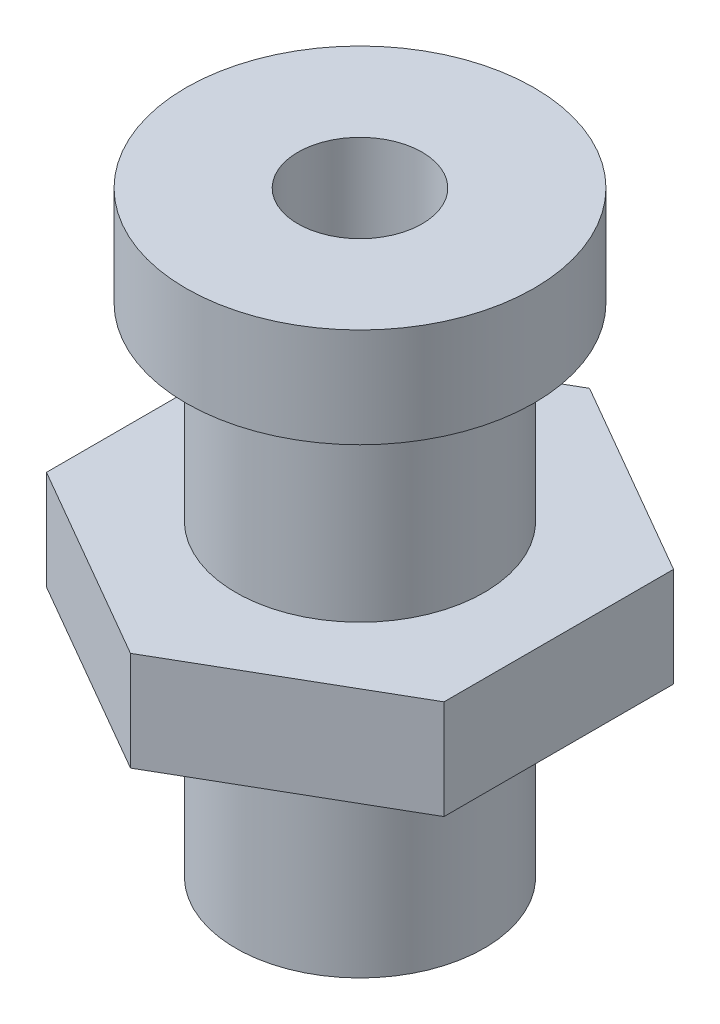
ISO-10303-21;
HEADER;
FILE_DESCRIPTION(('STEP AP214'),'2;1');
FILE_NAME('part.step','',(''),(''),'','','');
FILE_SCHEMA(('AUTOMOTIVE_DESIGN { 1 0 10303 214 1 1 1 1 }'));
ENDSEC;
DATA;
#1=APPLICATION_CONTEXT('core data for automotive mechanical design processes');
#2=APPLICATION_PROTOCOL_DEFINITION('international standard','automotive_design',2000,#1);
#3=PRODUCT_CONTEXT('',#1,'mechanical');
#4=PRODUCT('Part','Part','',(#3));
#5=PRODUCT_RELATED_PRODUCT_CATEGORY('part','',(#4));
#6=PRODUCT_DEFINITION_FORMATION('','',#4);
#7=PRODUCT_DEFINITION_CONTEXT('part definition',#1,'design');
#8=PRODUCT_DEFINITION('design','',#6,#7);
#9=PRODUCT_DEFINITION_SHAPE('','',#8);
#10=(LENGTH_UNIT() NAMED_UNIT(*) SI_UNIT(.MILLI.,.METRE.));
#11=(NAMED_UNIT(*) PLANE_ANGLE_UNIT() SI_UNIT($,.RADIAN.));
#12=(NAMED_UNIT(*) SI_UNIT($,.STERADIAN.) SOLID_ANGLE_UNIT());
#13=UNCERTAINTY_MEASURE_WITH_UNIT(LENGTH_MEASURE(1.E-05),#10,'distance_accuracy_value','');
#14=(GEOMETRIC_REPRESENTATION_CONTEXT(3) GLOBAL_UNCERTAINTY_ASSIGNED_CONTEXT((#13)) GLOBAL_UNIT_ASSIGNED_CONTEXT((#10,
#11,#12)) REPRESENTATION_CONTEXT('',''));
#15=CARTESIAN_POINT('',(0.,0.,0.));
#16=DIRECTION('',(0.,0.,1.));
#17=DIRECTION('',(1.,0.,0.));
#18=AXIS2_PLACEMENT_3D('',#15,#16,#17);
#19=CARTESIAN_POINT('',(0.,-2.,0.));
#20=DIRECTION('',(0.,-1.,0.));
#21=DIRECTION('',(0.,0.,-1.));
#22=AXIS2_PLACEMENT_3D('',#19,#20,#21);
#23=PLANE('',#22);
#24=DIRECTION('',(0.,0.,1.));
#25=VECTOR('',#24,1.);
#26=CARTESIAN_POINT('',(4.,-2.,-2.3094010767585));
#27=LINE('',#26,#25);
#28=CARTESIAN_POINT('',(4.,-2.,-2.3094010767585));
#29=VERTEX_POINT('',#28);
#30=CARTESIAN_POINT('',(4.,-2.,2.3094010767585));
#31=VERTEX_POINT('',#30);
#32=EDGE_CURVE('E129',#29,#31,#27,.T.);
#33=ORIENTED_EDGE('',*,*,#32,.T.);
#34=DIRECTION('',(-0.866025403784439,0.,0.5));
#35=VECTOR('',#34,1.);
#36=CARTESIAN_POINT('',(4.,-2.,2.3094010767585));
#37=LINE('',#36,#35);
#38=CARTESIAN_POINT('',(0.,-2.,4.61880215351701));
#39=VERTEX_POINT('',#38);
#40=EDGE_CURVE('E87',#31,#39,#37,.T.);
#41=ORIENTED_EDGE('',*,*,#40,.T.);
#42=DIRECTION('',(-0.866025403784439,0.,-0.5));
#43=VECTOR('',#42,1.);
#44=CARTESIAN_POINT('',(0.,-2.,4.61880215351701));
#45=LINE('',#44,#43);
#46=CARTESIAN_POINT('',(-4.,-2.,2.3094010767585));
#47=VERTEX_POINT('',#46);
#48=EDGE_CURVE('E100',#39,#47,#45,.T.);
#49=ORIENTED_EDGE('',*,*,#48,.T.);
#50=DIRECTION('',(0.,0.,-1.));
#51=VECTOR('',#50,1.);
#52=CARTESIAN_POINT('',(-4.,-2.,2.3094010767585));
#53=LINE('',#52,#51);
#54=CARTESIAN_POINT('',(-4.,-2.,-2.3094010767585));
#55=VERTEX_POINT('',#54);
#56=EDGE_CURVE('E94',#47,#55,#53,.T.);
#57=ORIENTED_EDGE('',*,*,#56,.T.);
#58=DIRECTION('',(0.866025403784439,0.,-0.5));
#59=VECTOR('',#58,1.);
#60=CARTESIAN_POINT('',(-4.,-2.,-2.3094010767585));
#61=LINE('',#60,#59);
#62=CARTESIAN_POINT('',(0.,-2.,-4.61880215351701));
#63=VERTEX_POINT('',#62);
#64=EDGE_CURVE('E98',#55,#63,#61,.T.);
#65=ORIENTED_EDGE('',*,*,#64,.T.);
#66=DIRECTION('',(0.866025403784439,0.,0.5));
#67=VECTOR('',#66,1.);
#68=CARTESIAN_POINT('',(0.,-2.,-4.61880215351701));
#69=LINE('',#68,#67);
#70=EDGE_CURVE('E49',#63,#29,#69,.T.);
#71=ORIENTED_EDGE('',*,*,#70,.T.);
#72=EDGE_LOOP('',(#33,#41,#49,#57,#65,#71));
#73=FACE_BOUND('',#72,.T.);
#74=CARTESIAN_POINT('',(0.,-2.,0.));
#75=DIRECTION('',(0.,-1.,0.));
#76=DIRECTION('',(0.,0.,-1.));
#77=AXIS2_PLACEMENT_3D('',#74,#75,#76);
#78=CIRCLE('',#77,2.5);
#79=CARTESIAN_POINT('',(0.,-2.,-2.5));
#80=VERTEX_POINT('',#79);
#81=EDGE_CURVE('E214',#80,#80,#78,.T.);
#82=ORIENTED_EDGE('',*,*,#81,.F.);
#83=EDGE_LOOP('',(#82));
#84=FACE_BOUND('',#83,.T.);
#85=ADVANCED_FACE('F32',(#73,#84),#23,.T.);
#86=CARTESIAN_POINT('',(0.,0.,0.));
#87=DIRECTION('',(0.,-1.,0.));
#88=DIRECTION('',(0.,0.,-1.));
#89=AXIS2_PLACEMENT_3D('',#86,#87,#88);
#90=CYLINDRICAL_SURFACE('',#89,1.25);
#91=CARTESIAN_POINT('',(0.,5.8,0.));
#92=DIRECTION('',(0.,-1.,0.));
#93=DIRECTION('',(0.,0.,-1.));
#94=AXIS2_PLACEMENT_3D('',#91,#92,#93);
#95=CIRCLE('',#94,1.25);
#96=CARTESIAN_POINT('',(0.,5.8,-1.25));
#97=VERTEX_POINT('',#96);
#98=EDGE_CURVE('E11',#97,#97,#95,.T.);
#99=ORIENTED_EDGE('',*,*,#98,.F.);
#100=EDGE_LOOP('',(#99));
#101=FACE_BOUND('',#100,.T.);
#102=CARTESIAN_POINT('',(0.,-6.2,0.));
#103=DIRECTION('',(0.,-1.,0.));
#104=DIRECTION('',(0.,0.,-1.));
#105=AXIS2_PLACEMENT_3D('',#102,#103,#104);
#106=CIRCLE('',#105,1.25);
#107=CARTESIAN_POINT('',(0.,-6.2,-1.25));
#108=VERTEX_POINT('',#107);
#109=EDGE_CURVE('E217',#108,#108,#106,.T.);
#110=ORIENTED_EDGE('',*,*,#109,.T.);
#111=EDGE_LOOP('',(#110));
#112=FACE_BOUND('',#111,.T.);
#113=ADVANCED_FACE('F34',(#101,#112),#90,.F.);
#114=CARTESIAN_POINT('',(1.25,5.8,0.));
#115=DIRECTION('',(0.,1.,0.));
#116=DIRECTION('',(0.,0.,1.));
#117=AXIS2_PLACEMENT_3D('',#114,#115,#116);
#118=PLANE('',#117);
#119=ORIENTED_EDGE('',*,*,#98,.T.);
#120=EDGE_LOOP('',(#119));
#121=FACE_BOUND('',#120,.T.);
#122=CARTESIAN_POINT('',(0.,5.8,0.));
#123=DIRECTION('',(0.,-1.,0.));
#124=DIRECTION('',(0.,0.,-1.));
#125=AXIS2_PLACEMENT_3D('',#122,#123,#124);
#126=CIRCLE('',#125,3.5);
#127=CARTESIAN_POINT('',(0.,5.8,-3.5));
#128=VERTEX_POINT('',#127);
#129=EDGE_CURVE('E41',#128,#128,#126,.T.);
#130=ORIENTED_EDGE('',*,*,#129,.F.);
#131=EDGE_LOOP('',(#130));
#132=FACE_BOUND('',#131,.T.);
#133=ADVANCED_FACE('F152',(#121,#132),#118,.T.);
#134=CARTESIAN_POINT('',(0.,0.,0.));
#135=DIRECTION('',(0.,-1.,0.));
#136=DIRECTION('',(0.,0.,-1.));
#137=AXIS2_PLACEMENT_3D('',#134,#135,#136);
#138=CYLINDRICAL_SURFACE('',#137,3.5);
#139=ORIENTED_EDGE('',*,*,#129,.T.);
#140=EDGE_LOOP('',(#139));
#141=FACE_BOUND('',#140,.T.);
#142=CARTESIAN_POINT('',(0.,3.8,0.));
#143=DIRECTION('',(0.,-1.,0.));
#144=DIRECTION('',(0.,0.,-1.));
#145=AXIS2_PLACEMENT_3D('',#142,#143,#144);
#146=CIRCLE('',#145,3.5);
#147=CARTESIAN_POINT('',(0.,3.8,-3.5));
#148=VERTEX_POINT('',#147);
#149=EDGE_CURVE('E144',#148,#148,#146,.T.);
#150=ORIENTED_EDGE('',*,*,#149,.F.);
#151=EDGE_LOOP('',(#150));
#152=FACE_BOUND('',#151,.T.);
#153=ADVANCED_FACE('F149',(#141,#152),#138,.T.);
#154=CARTESIAN_POINT('',(3.5,3.8,0.));
#155=DIRECTION('',(0.,-1.,0.));
#156=DIRECTION('',(0.,0.,-1.));
#157=AXIS2_PLACEMENT_3D('',#154,#155,#156);
#158=PLANE('',#157);
#159=ORIENTED_EDGE('',*,*,#149,.T.);
#160=EDGE_LOOP('',(#159));
#161=FACE_BOUND('',#160,.T.);
#162=CARTESIAN_POINT('',(0.,3.8,0.));
#163=DIRECTION('',(0.,-1.,0.));
#164=DIRECTION('',(0.,0.,-1.));
#165=AXIS2_PLACEMENT_3D('',#162,#163,#164);
#166=CIRCLE('',#165,2.5);
#167=CARTESIAN_POINT('',(0.,3.8,-2.5));
#168=VERTEX_POINT('',#167);
#169=EDGE_CURVE('E141',#168,#168,#166,.T.);
#170=ORIENTED_EDGE('',*,*,#169,.F.);
#171=EDGE_LOOP('',(#170));
#172=FACE_BOUND('',#171,.T.);
#173=ADVANCED_FACE('F159',(#161,#172),#158,.T.);
#174=CARTESIAN_POINT('',(0.,0.,0.));
#175=DIRECTION('',(0.,-1.,0.));
#176=DIRECTION('',(0.,0.,-1.));
#177=AXIS2_PLACEMENT_3D('',#174,#175,#176);
#178=CYLINDRICAL_SURFACE('',#177,2.5);
#179=ORIENTED_EDGE('',*,*,#169,.T.);
#180=EDGE_LOOP('',(#179));
#181=FACE_BOUND('',#180,.T.);
#182=CARTESIAN_POINT('',(0.,0.,0.));
#183=DIRECTION('',(0.,-1.,0.));
#184=DIRECTION('',(0.,0.,-1.));
#185=AXIS2_PLACEMENT_3D('',#182,#183,#184);
#186=CIRCLE('',#185,2.5);
#187=CARTESIAN_POINT('',(0.,0.,-2.5));
#188=VERTEX_POINT('',#187);
#189=EDGE_CURVE('E138',#188,#188,#186,.T.);
#190=ORIENTED_EDGE('',*,*,#189,.F.);
#191=EDGE_LOOP('',(#190));
#192=FACE_BOUND('',#191,.T.);
#193=ADVANCED_FACE('F174',(#181,#192),#178,.T.);
#194=CARTESIAN_POINT('',(0.,0.,0.));
#195=DIRECTION('',(0.,-1.,0.));
#196=DIRECTION('',(0.,0.,-1.));
#197=AXIS2_PLACEMENT_3D('',#194,#195,#196);
#198=PLANE('',#197);
#199=ORIENTED_EDGE('',*,*,#189,.T.);
#200=EDGE_LOOP('',(#199));
#201=FACE_BOUND('',#200,.T.);
#202=DIRECTION('',(0.,0.,1.));
#203=VECTOR('',#202,1.);
#204=CARTESIAN_POINT('',(4.,0.,-2.3094010767585));
#205=LINE('',#204,#203);
#206=CARTESIAN_POINT('',(4.,0.,-2.3094010767585));
#207=VERTEX_POINT('',#206);
#208=CARTESIAN_POINT('',(4.,0.,2.3094010767585));
#209=VERTEX_POINT('',#208);
#210=EDGE_CURVE('E118',#207,#209,#205,.T.);
#211=ORIENTED_EDGE('',*,*,#210,.F.);
#212=DIRECTION('',(0.866025403784439,0.,0.5));
#213=VECTOR('',#212,1.);
#214=CARTESIAN_POINT('',(0.,0.,-4.61880215351701));
#215=LINE('',#214,#213);
#216=CARTESIAN_POINT('',(0.,0.,-4.61880215351701));
#217=VERTEX_POINT('',#216);
#218=EDGE_CURVE('E78',#217,#207,#215,.T.);
#219=ORIENTED_EDGE('',*,*,#218,.F.);
#220=DIRECTION('',(0.866025403784439,0.,-0.5));
#221=VECTOR('',#220,1.);
#222=CARTESIAN_POINT('',(-4.,0.,-2.3094010767585));
#223=LINE('',#222,#221);
#224=CARTESIAN_POINT('',(-4.,0.,-2.3094010767585));
#225=VERTEX_POINT('',#224);
#226=EDGE_CURVE('E72',#225,#217,#223,.T.);
#227=ORIENTED_EDGE('',*,*,#226,.F.);
#228=DIRECTION('',(0.,0.,-1.));
#229=VECTOR('',#228,1.);
#230=CARTESIAN_POINT('',(-4.,0.,2.3094010767585));
#231=LINE('',#230,#229);
#232=CARTESIAN_POINT('',(-4.,0.,2.3094010767585));
#233=VERTEX_POINT('',#232);
#234=EDGE_CURVE('E108',#233,#225,#231,.T.);
#235=ORIENTED_EDGE('',*,*,#234,.F.);
#236=DIRECTION('',(-0.866025403784439,0.,-0.5));
#237=VECTOR('',#236,1.);
#238=CARTESIAN_POINT('',(0.,0.,4.61880215351701));
#239=LINE('',#238,#237);
#240=CARTESIAN_POINT('',(0.,0.,4.61880215351701));
#241=VERTEX_POINT('',#240);
#242=EDGE_CURVE('E124',#241,#233,#239,.T.);
#243=ORIENTED_EDGE('',*,*,#242,.F.);
#244=DIRECTION('',(-0.866025403784439,0.,0.5));
#245=VECTOR('',#244,1.);
#246=CARTESIAN_POINT('',(4.,0.,2.3094010767585));
#247=LINE('',#246,#245);
#248=EDGE_CURVE('E121',#209,#241,#247,.T.);
#249=ORIENTED_EDGE('',*,*,#248,.F.);
#250=EDGE_LOOP('',(#211,#219,#227,#235,#243,#249));
#251=FACE_BOUND('',#250,.T.);
#252=ADVANCED_FACE('F170',(#201,#251),#198,.F.);
#253=CARTESIAN_POINT('',(4.,-2.,-2.3094010767585));
#254=DIRECTION('',(-1.,0.,0.));
#255=DIRECTION('',(0.,0.,1.));
#256=AXIS2_PLACEMENT_3D('',#253,#254,#255);
#257=PLANE('',#256);
#258=ORIENTED_EDGE('',*,*,#210,.T.);
#259=DIRECTION('',(0.,1.,0.));
#260=VECTOR('',#259,1.);
#261=CARTESIAN_POINT('',(4.,-2.,2.3094010767585));
#262=LINE('',#261,#260);
#263=EDGE_CURVE('E136',#31,#209,#262,.T.);
#264=ORIENTED_EDGE('',*,*,#263,.F.);
#265=ORIENTED_EDGE('',*,*,#32,.F.);
#266=DIRECTION('',(0.,1.,0.));
#267=VECTOR('',#266,1.);
#268=CARTESIAN_POINT('',(4.,-2.,-2.3094010767585));
#269=LINE('',#268,#267);
#270=EDGE_CURVE('E114',#29,#207,#269,.T.);
#271=ORIENTED_EDGE('',*,*,#270,.T.);
#272=EDGE_LOOP('',(#258,#264,#265,#271));
#273=FACE_BOUND('',#272,.T.);
#274=ADVANCED_FACE('F173',(#273),#257,.F.);
#275=CARTESIAN_POINT('',(4.,-2.,2.3094010767585));
#276=DIRECTION('',(-0.5,0.,-0.866025403784439));
#277=DIRECTION('',(-0.866025403784439,0.,0.5));
#278=AXIS2_PLACEMENT_3D('',#275,#276,#277);
#279=PLANE('',#278);
#280=ORIENTED_EDGE('',*,*,#248,.T.);
#281=DIRECTION('',(0.,1.,0.));
#282=VECTOR('',#281,1.);
#283=CARTESIAN_POINT('',(0.,-2.,4.61880215351701));
#284=LINE('',#283,#282);
#285=EDGE_CURVE('E133',#39,#241,#284,.T.);
#286=ORIENTED_EDGE('',*,*,#285,.F.);
#287=ORIENTED_EDGE('',*,*,#40,.F.);
#288=ORIENTED_EDGE('',*,*,#263,.T.);
#289=EDGE_LOOP('',(#280,#286,#287,#288));
#290=FACE_BOUND('',#289,.T.);
#291=ADVANCED_FACE('F187',(#290),#279,.F.);
#292=CARTESIAN_POINT('',(0.,-2.,4.61880215351701));
#293=DIRECTION('',(0.5,0.,-0.866025403784439));
#294=DIRECTION('',(-0.866025403784439,0.,-0.5));
#295=AXIS2_PLACEMENT_3D('',#292,#293,#294);
#296=PLANE('',#295);
#297=ORIENTED_EDGE('',*,*,#242,.T.);
#298=DIRECTION('',(0.,1.,0.));
#299=VECTOR('',#298,1.);
#300=CARTESIAN_POINT('',(-4.,-2.,2.3094010767585));
#301=LINE('',#300,#299);
#302=EDGE_CURVE('E109',#47,#233,#301,.T.);
#303=ORIENTED_EDGE('',*,*,#302,.F.);
#304=ORIENTED_EDGE('',*,*,#48,.F.);
#305=ORIENTED_EDGE('',*,*,#285,.T.);
#306=EDGE_LOOP('',(#297,#303,#304,#305));
#307=FACE_BOUND('',#306,.T.);
#308=ADVANCED_FACE('F184',(#307),#296,.F.);
#309=CARTESIAN_POINT('',(-4.,-2.,2.3094010767585));
#310=DIRECTION('',(1.,0.,0.));
#311=DIRECTION('',(0.,0.,-1.));
#312=AXIS2_PLACEMENT_3D('',#309,#310,#311);
#313=PLANE('',#312);
#314=ORIENTED_EDGE('',*,*,#234,.T.);
#315=DIRECTION('',(0.,1.,0.));
#316=VECTOR('',#315,1.);
#317=CARTESIAN_POINT('',(-4.,-2.,-2.3094010767585));
#318=LINE('',#317,#316);
#319=EDGE_CURVE('E105',#55,#225,#318,.T.);
#320=ORIENTED_EDGE('',*,*,#319,.F.);
#321=ORIENTED_EDGE('',*,*,#56,.F.);
#322=ORIENTED_EDGE('',*,*,#302,.T.);
#323=EDGE_LOOP('',(#314,#320,#321,#322));
#324=FACE_BOUND('',#323,.T.);
#325=ADVANCED_FACE('F106',(#324),#313,.F.);
#326=CARTESIAN_POINT('',(-4.,-2.,-2.3094010767585));
#327=DIRECTION('',(0.5,0.,0.866025403784439));
#328=DIRECTION('',(0.866025403784439,0.,-0.5));
#329=AXIS2_PLACEMENT_3D('',#326,#327,#328);
#330=PLANE('',#329);
#331=ORIENTED_EDGE('',*,*,#226,.T.);
#332=DIRECTION('',(0.,1.,0.));
#333=VECTOR('',#332,1.);
#334=CARTESIAN_POINT('',(0.,-2.,-4.61880215351701));
#335=LINE('',#334,#333);
#336=EDGE_CURVE('E110',#63,#217,#335,.T.);
#337=ORIENTED_EDGE('',*,*,#336,.F.);
#338=ORIENTED_EDGE('',*,*,#64,.F.);
#339=ORIENTED_EDGE('',*,*,#319,.T.);
#340=EDGE_LOOP('',(#331,#337,#338,#339));
#341=FACE_BOUND('',#340,.T.);
#342=ADVANCED_FACE('F112',(#341),#330,.F.);
#343=CARTESIAN_POINT('',(0.,-2.,-4.61880215351701));
#344=DIRECTION('',(-0.5,0.,0.866025403784439));
#345=DIRECTION('',(0.866025403784439,0.,0.5));
#346=AXIS2_PLACEMENT_3D('',#343,#344,#345);
#347=PLANE('',#346);
#348=ORIENTED_EDGE('',*,*,#218,.T.);
#349=ORIENTED_EDGE('',*,*,#270,.F.);
#350=ORIENTED_EDGE('',*,*,#70,.F.);
#351=ORIENTED_EDGE('',*,*,#336,.T.);
#352=EDGE_LOOP('',(#348,#349,#350,#351));
#353=FACE_BOUND('',#352,.T.);
#354=ADVANCED_FACE('F176',(#353),#347,.F.);
#355=CARTESIAN_POINT('',(0.,-6.2,0.));
#356=DIRECTION('',(0.,-1.,0.));
#357=DIRECTION('',(0.,0.,-1.));
#358=AXIS2_PLACEMENT_3D('',#355,#356,#357);
#359=PLANE('',#358);
#360=CARTESIAN_POINT('',(0.,-6.2,0.));
#361=DIRECTION('',(0.,-1.,0.));
#362=DIRECTION('',(0.,0.,-1.));
#363=AXIS2_PLACEMENT_3D('',#360,#361,#362);
#364=CIRCLE('',#363,2.5);
#365=CARTESIAN_POINT('',(0.,-6.2,-2.5));
#366=VERTEX_POINT('',#365);
#367=EDGE_CURVE('E122',#366,#366,#364,.T.);
#368=ORIENTED_EDGE('',*,*,#367,.T.);
#369=EDGE_LOOP('',(#368));
#370=FACE_BOUND('',#369,.T.);
#371=ORIENTED_EDGE('',*,*,#109,.F.);
#372=EDGE_LOOP('',(#371));
#373=FACE_BOUND('',#372,.T.);
#374=ADVANCED_FACE('F179',(#370,#373),#359,.T.);
#375=CARTESIAN_POINT('',(0.,-6.2,0.));
#376=DIRECTION('',(0.,1.,0.));
#377=DIRECTION('',(0.,0.,1.));
#378=AXIS2_PLACEMENT_3D('',#375,#376,#377);
#379=CYLINDRICAL_SURFACE('',#378,2.5);
#380=ORIENTED_EDGE('',*,*,#367,.F.);
#381=EDGE_LOOP('',(#380));
#382=FACE_BOUND('',#381,.T.);
#383=ORIENTED_EDGE('',*,*,#81,.T.);
#384=EDGE_LOOP('',(#383));
#385=FACE_BOUND('',#384,.T.);
#386=ADVANCED_FACE('F168',(#382,#385),#379,.T.);
#387=CLOSED_SHELL('',(#85,#113,#133,#153,#173,#193,#252,#274,#291,#308,#325,#342,#354,#374,#386));
#388=MANIFOLD_SOLID_BREP('B2',#387);
#389=ADVANCED_BREP_SHAPE_REPRESENTATION('',(#18,#388),#14);
#390=SHAPE_DEFINITION_REPRESENTATION(#9,#389);
ENDSEC;
END-ISO-10303-21;
